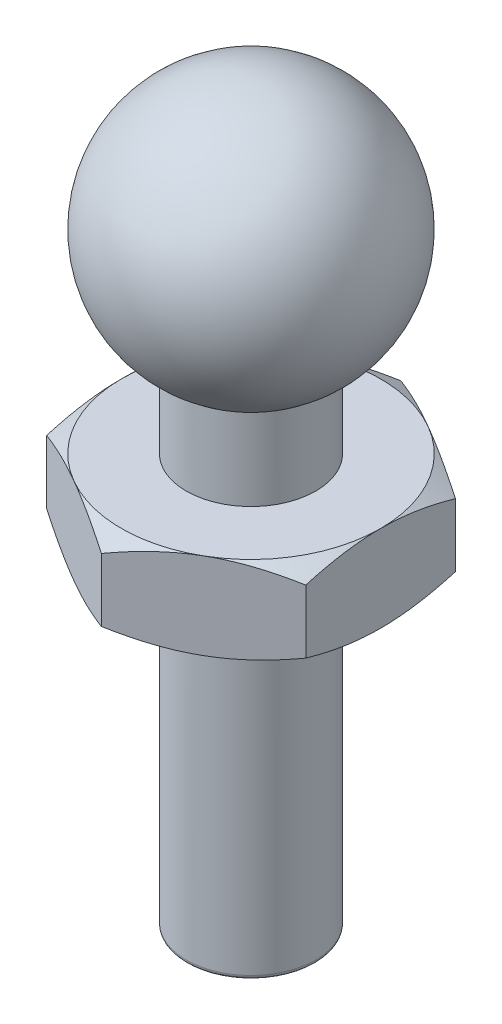
ISO-10303-21;
HEADER;
FILE_DESCRIPTION(('STEP AP214'),'2;1');
FILE_NAME('part.step','',(''),(''),'','','');
FILE_SCHEMA(('AUTOMOTIVE_DESIGN { 1 0 10303 214 1 1 1 1 }'));
ENDSEC;
DATA;
#1=APPLICATION_CONTEXT('core data for automotive mechanical design processes');
#2=APPLICATION_PROTOCOL_DEFINITION('international standard','automotive_design',2000,#1);
#3=PRODUCT_CONTEXT('',#1,'mechanical');
#4=PRODUCT('Part','Part','',(#3));
#5=PRODUCT_RELATED_PRODUCT_CATEGORY('part','',(#4));
#6=PRODUCT_DEFINITION_FORMATION('','',#4);
#7=PRODUCT_DEFINITION_CONTEXT('part definition',#1,'design');
#8=PRODUCT_DEFINITION('design','',#6,#7);
#9=PRODUCT_DEFINITION_SHAPE('','',#8);
#10=(LENGTH_UNIT() NAMED_UNIT(*) SI_UNIT(.MILLI.,.METRE.));
#11=(NAMED_UNIT(*) PLANE_ANGLE_UNIT() SI_UNIT($,.RADIAN.));
#12=(NAMED_UNIT(*) SI_UNIT($,.STERADIAN.) SOLID_ANGLE_UNIT());
#13=UNCERTAINTY_MEASURE_WITH_UNIT(LENGTH_MEASURE(1.E-05),#10,'distance_accuracy_value','');
#14=(GEOMETRIC_REPRESENTATION_CONTEXT(3) GLOBAL_UNCERTAINTY_ASSIGNED_CONTEXT((#13)) GLOBAL_UNIT_ASSIGNED_CONTEXT((#10,
#11,#12)) REPRESENTATION_CONTEXT('',''));
#15=CARTESIAN_POINT('',(0.,0.,0.));
#16=DIRECTION('',(0.,0.,1.));
#17=DIRECTION('',(1.,0.,0.));
#18=AXIS2_PLACEMENT_3D('',#15,#16,#17);
#19=CARTESIAN_POINT('',(3.,9.5,1.73205080756888));
#20=DIRECTION('',(-1.,0.,0.));
#21=DIRECTION('',(0.,0.,1.));
#22=AXIS2_PLACEMENT_3D('',#19,#20,#21);
#23=PLANE('',#22);
#24=CARTESIAN_POINT('',(3.,7.49669275597267,5.73225080756888));
#25=CARTESIAN_POINT('',(3.,7.56535762873894,5.59799811373669));
#26=CARTESIAN_POINT('',(3.,7.63362658074956,5.46354106552018));
#27=CARTESIAN_POINT('',(3.,7.7691751977503,5.19412594711896));
#28=CARTESIAN_POINT('',(3.,7.83645484167597,5.05916786634262));
#29=CARTESIAN_POINT('',(3.,7.96993872408742,4.78843231789163));
#30=CARTESIAN_POINT('',(3.,8.0361409223391,4.65265384244875));
#31=CARTESIAN_POINT('',(3.,8.16708055525372,4.38038885038152));
#32=CARTESIAN_POINT('',(3.,8.23181796851999,4.24390232345015));
#33=CARTESIAN_POINT('',(3.,8.36273075239076,3.96310511366176));
#34=CARTESIAN_POINT('',(3.,8.42881132731156,3.81875010473635));
#35=CARTESIAN_POINT('',(3.,8.55842928727965,3.52890389215656));
#36=CARTESIAN_POINT('',(3.,8.62196674541402,3.38341272129836));
#37=CARTESIAN_POINT('',(3.,8.74573518476893,3.0911428032025));
#38=CARTESIAN_POINT('',(3.,8.80596844827941,2.94436502804428));
#39=CARTESIAN_POINT('',(3.,8.92221294586851,2.64909731827644));
#40=CARTESIAN_POINT('',(3.,8.97822314680859,2.50060697487877));
#41=CARTESIAN_POINT('',(3.,9.09420348606466,2.17495473766774));
#42=CARTESIAN_POINT('',(3.,9.15309774811246,1.99740334689548));
#43=CARTESIAN_POINT('',(3.,9.26029523419006,1.63917764376158));
#44=CARTESIAN_POINT('',(3.,9.30860404614459,1.45850503366087));
#45=CARTESIAN_POINT('',(3.,9.39023263279609,1.09720914532956));
#46=CARTESIAN_POINT('',(3.,9.42381477693698,0.916647599895759));
#47=CARTESIAN_POINT('',(3.,9.46126742176692,0.644079261802789));
#48=CARTESIAN_POINT('',(3.,9.47159787377878,0.552943422867096));
#49=CARTESIAN_POINT('',(3.,9.48763454600052,0.370270654947729));
#50=CARTESIAN_POINT('',(3.,9.49334144079801,0.278733786435311));
#51=CARTESIAN_POINT('',(3.,9.49996614854262,0.0944078517722107));
#52=CARTESIAN_POINT('',(3.,9.5008268616344,0.00161671746076241));
#53=CARTESIAN_POINT('',(3.,9.49757525562797,-0.183877598413798));
#54=CARTESIAN_POINT('',(3.,9.49346292019229,-0.276580779686966));
#55=CARTESIAN_POINT('',(3.,9.48041370767168,-0.461668088480513));
#56=CARTESIAN_POINT('',(3.,9.47147558711607,-0.554052127589441));
#57=CARTESIAN_POINT('',(3.,9.4490819835307,-0.738276464049772));
#58=CARTESIAN_POINT('',(3.,9.43562578745626,-0.830116673244042));
#59=CARTESIAN_POINT('',(3.,9.38848678345653,-1.1081241349506));
#60=CARTESIAN_POINT('',(3.,9.34831083516922,-1.29320289274649));
#61=CARTESIAN_POINT('',(3.,9.25483304091392,-1.65992833453579));
#62=CARTESIAN_POINT('',(3.,9.20152817481691,-1.8415742184766));
#63=CARTESIAN_POINT('',(3.,9.09001482170302,-2.18718321983853));
#64=CARTESIAN_POINT('',(3.,9.03254960886738,-2.35139002090273));
#65=CARTESIAN_POINT('',(3.,8.91157770593577,-2.67757637701535));
#66=CARTESIAN_POINT('',(3.,8.84806982210383,-2.83955548471668));
#67=CARTESIAN_POINT('',(3.,8.71649668995848,-3.16180541641892));
#68=CARTESIAN_POINT('',(3.,8.64842746398323,-3.32207460435457));
#69=CARTESIAN_POINT('',(3.,8.50888164672137,-3.64112437712565));
#70=CARTESIAN_POINT('',(3.,8.43740489080743,-3.79990488959462));
#71=CARTESIAN_POINT('',(3.,8.29572041514807,-4.10783154121877));
#72=CARTESIAN_POINT('',(3.,8.22564804300012,-4.25704019529893));
#73=CARTESIAN_POINT('',(3.,8.0836551872923,-4.55457880885657));
#74=CARTESIAN_POINT('',(3.,8.01173465191385,-4.70290874355283));
#75=CARTESIAN_POINT('',(3.,7.8666308572428,-4.99841900754648));
#76=CARTESIAN_POINT('',(3.,7.79345182235509,-5.14560141584992));
#77=CARTESIAN_POINT('',(3.,7.64590152942625,-5.43935321353678));
#78=CARTESIAN_POINT('',(3.,7.57153036655204,-5.58592265068708));
#79=CARTESIAN_POINT('',(3.,7.49669275597267,-5.73225080756888));
#80=B_SPLINE_CURVE_WITH_KNOTS('',3,(#24,#25,#26,#27,#28,#29,#30,#31,#32,#33,#34,#35,#36,#37,#38,
#39,#40,#41,#42,#43,#44,#45,#46,#47,#48,#49,#50,#51,#52,#53,#54,#55,#56,#57,#58,#59,#60,#61,#62,
#63,#64,#65,#66,#67,#68,#69,#70,#71,#72,#73,#74,#75,#76,#77,#78,#79),.UNSPECIFIED.,.F.,.F.,(4,2,
2,2,2,2,2,2,2,2,2,2,2,2,2,2,2,2,2,2,2,2,2,2,2,2,2,4),(0.,0.452382016001322,0.90477365026535,
1.35794045354517,1.81111387213612,2.2873771437625,2.76362671813268,3.23954308217786,
3.71557550010852,4.27652369616462,4.83717505756687,5.38738613645125,5.66244417939779,
5.937462083513,6.21571369559986,6.4939662218021,6.77229048018743,7.05065868449287,
7.61810965270507,8.18569127741244,8.70745206667822,9.2293161451901,9.75164138486646,
10.2739918851653,10.7685068932809,11.2630357817083,11.756143015984,12.2492110799155),.UNSPECIFIED.);
#81=CARTESIAN_POINT('',(3.,9.23205080756888,1.73205080756888));
#82=VERTEX_POINT('',#81);
#83=CARTESIAN_POINT('',(3.,9.5,0.));
#84=VERTEX_POINT('',#83);
#85=EDGE_CURVE('E171',#82,#84,#80,.T.);
#86=ORIENTED_EDGE('',*,*,#85,.F.);
#87=DIRECTION('',(0.,-1.,0.));
#88=VECTOR('',#87,1.);
#89=CARTESIAN_POINT('',(3.,9.5,1.73205080756888));
#90=LINE('',#89,#88);
#91=CARTESIAN_POINT('',(3.,7.7679491924311,1.73205080756891));
#92=VERTEX_POINT('',#91);
#93=EDGE_CURVE('E295',#82,#92,#90,.T.);
#94=ORIENTED_EDGE('',*,*,#93,.T.);
#95=CARTESIAN_POINT('',(3.,9.50330724402733,-5.73225080756888));
#96=CARTESIAN_POINT('',(3.,9.43464237126105,-5.59799811373669));
#97=CARTESIAN_POINT('',(3.,9.36637341925044,-5.46354106552018));
#98=CARTESIAN_POINT('',(3.,9.2308248022497,-5.19412594711896));
#99=CARTESIAN_POINT('',(3.,9.16354515832403,-5.05916786634262));
#100=CARTESIAN_POINT('',(3.,9.03006127591258,-4.78843231789163));
#101=CARTESIAN_POINT('',(3.,8.9638590776609,-4.65265384244875));
#102=CARTESIAN_POINT('',(3.,8.83291944474628,-4.38038885038152));
#103=CARTESIAN_POINT('',(3.,8.76818203148001,-4.24390232345015));
#104=CARTESIAN_POINT('',(3.,8.63726924760924,-3.96310511366177));
#105=CARTESIAN_POINT('',(3.,8.57118867268844,-3.81875010473635));
#106=CARTESIAN_POINT('',(3.,8.44157071272035,-3.52890389215656));
#107=CARTESIAN_POINT('',(3.,8.37803325458598,-3.38341272129837));
#108=CARTESIAN_POINT('',(3.,8.25426481523107,-3.0911428032025));
#109=CARTESIAN_POINT('',(3.,8.19403155172058,-2.94436502804428));
#110=CARTESIAN_POINT('',(3.,8.07778705413149,-2.64909731827645));
#111=CARTESIAN_POINT('',(3.,8.02177685319141,-2.50060697487878));
#112=CARTESIAN_POINT('',(3.,7.90579651393534,-2.17495473766774));
#113=CARTESIAN_POINT('',(3.,7.84690225188753,-1.99740334689548));
#114=CARTESIAN_POINT('',(3.,7.73970476580994,-1.63917764376159));
#115=CARTESIAN_POINT('',(3.,7.6913959538554,-1.45850503366087));
#116=CARTESIAN_POINT('',(3.,7.60976736720391,-1.09720914532957));
#117=CARTESIAN_POINT('',(3.,7.57618522306301,-0.916647599895763));
#118=CARTESIAN_POINT('',(3.,7.53873257823308,-0.644079261802793));
#119=CARTESIAN_POINT('',(3.,7.52840212622121,-0.5529434228671));
#120=CARTESIAN_POINT('',(3.,7.51236545399948,-0.370270654947734));
#121=CARTESIAN_POINT('',(3.,7.50665855920199,-0.278733786435315));
#122=CARTESIAN_POINT('',(3.,7.50003385145738,-0.0944078517722148));
#123=CARTESIAN_POINT('',(3.,7.4991731383656,-0.00161671746076664));
#124=CARTESIAN_POINT('',(3.,7.50242474437203,0.183877598413794));
#125=CARTESIAN_POINT('',(3.,7.50653707980771,0.276580779686962));
#126=CARTESIAN_POINT('',(3.,7.51958629232831,0.461668088480508));
#127=CARTESIAN_POINT('',(3.,7.52852441288392,0.554052127589436));
#128=CARTESIAN_POINT('',(3.,7.5509180164693,0.738276464049767));
#129=CARTESIAN_POINT('',(3.,7.56437421254374,0.830116673244036));
#130=CARTESIAN_POINT('',(3.,7.61151321654346,1.10812413495059));
#131=CARTESIAN_POINT('',(3.,7.65168916483078,1.29320289274649));
#132=CARTESIAN_POINT('',(3.,7.74516695908608,1.65992833453578));
#133=CARTESIAN_POINT('',(3.,7.79847182518309,1.84157421847659));
#134=CARTESIAN_POINT('',(3.,7.90998517829697,2.18718321983852));
#135=CARTESIAN_POINT('',(3.,7.96745039113261,2.35139002090273));
#136=CARTESIAN_POINT('',(3.,8.08842229406423,2.67757637701535));
#137=CARTESIAN_POINT('',(3.,8.15193017789617,2.83955548471668));
#138=CARTESIAN_POINT('',(3.,8.28350331004152,3.16180541641892));
#139=CARTESIAN_POINT('',(3.,8.35157253601677,3.32207460435457));
#140=CARTESIAN_POINT('',(3.,8.49111835327863,3.64112437712565));
#141=CARTESIAN_POINT('',(3.,8.56259510919257,3.79990488959462));
#142=CARTESIAN_POINT('',(3.,8.70427958485193,4.10783154121877));
#143=CARTESIAN_POINT('',(3.,8.77435195699987,4.25704019529893));
#144=CARTESIAN_POINT('',(3.,8.9163448127077,4.55457880885657));
#145=CARTESIAN_POINT('',(3.,8.98826534808615,4.70290874355283));
#146=CARTESIAN_POINT('',(3.,9.13336914275719,4.99841900754648));
#147=CARTESIAN_POINT('',(3.,9.20654817764491,5.14560141584992));
#148=CARTESIAN_POINT('',(3.,9.35409847057374,5.43935321353677));
#149=CARTESIAN_POINT('',(3.,9.42846963344796,5.58592265068707));
#150=CARTESIAN_POINT('',(3.,9.50330724402733,5.73225080756888));
#151=B_SPLINE_CURVE_WITH_KNOTS('',3,(#95,#96,#97,#98,#99,#100,#101,#102,#103,#104,#105,#106,
#107,#108,#109,#110,#111,#112,#113,#114,#115,#116,#117,#118,#119,#120,#121,#122,#123,#124,#125,
#126,#127,#128,#129,#130,#131,#132,#133,#134,#135,#136,#137,#138,#139,#140,#141,#142,#143,#144,
#145,#146,#147,#148,#149,#150),.UNSPECIFIED.,.F.,.F.,(4,2,2,2,2,2,2,2,2,2,2,2,2,2,2,2,2,2,2,2,2,
2,2,2,2,2,2,4),(0.,0.452382016001322,0.904773650265349,1.35794045354517,1.81111387213612,
2.2873771437625,2.76362671813268,3.23954308217786,3.71557550010852,4.27652369616462,
4.83717505756687,5.38738613645124,5.66244417939779,5.937462083513,6.21571369559986,
6.4939662218021,6.77229048018743,7.05065868449287,7.61810965270507,8.18569127741243,
8.70745206667821,9.2293161451901,9.75164138486646,10.2739918851653,10.7685068932809,
11.2630357817083,11.756143015984,12.2492110799155),.UNSPECIFIED.);
#152=CARTESIAN_POINT('',(3.,7.5,0.));
#153=VERTEX_POINT('',#152);
#154=EDGE_CURVE('E338',#153,#92,#151,.T.);
#155=ORIENTED_EDGE('',*,*,#154,.F.);
#156=CARTESIAN_POINT('',(3.,7.76794919243112,-1.73205080756888));
#157=VERTEX_POINT('',#156);
#158=EDGE_CURVE('E344',#157,#153,#151,.T.);
#159=ORIENTED_EDGE('',*,*,#158,.F.);
#160=DIRECTION('',(0.,-1.,0.));
#161=VECTOR('',#160,1.);
#162=CARTESIAN_POINT('',(3.,9.5,-1.73205080756888));
#163=LINE('',#162,#161);
#164=CARTESIAN_POINT('',(3.,9.23205080756888,-1.73205080756888));
#165=VERTEX_POINT('',#164);
#166=EDGE_CURVE('E306',#165,#157,#163,.T.);
#167=ORIENTED_EDGE('',*,*,#166,.F.);
#168=EDGE_CURVE('E163',#84,#165,#80,.T.);
#169=ORIENTED_EDGE('',*,*,#168,.F.);
#170=EDGE_LOOP('',(#86,#94,#155,#159,#167,#169));
#171=FACE_BOUND('',#170,.T.);
#172=ADVANCED_FACE('F47',(#171),#23,.F.);
#173=CARTESIAN_POINT('',(0.,9.5,3.46410161513775));
#174=DIRECTION('',(-0.5,0.,-0.866025403784439));
#175=DIRECTION('',(-0.866025403784439,0.,0.5));
#176=AXIS2_PLACEMENT_3D('',#173,#174,#175);
#177=PLANE('',#176);
#178=CARTESIAN_POINT('',(-0.000200000000000962,9.23198413756899,3.46421708519159));
#179=CARTESIAN_POINT('',(0.131635206588331,9.27594629554769,3.38810199317915));
#180=CARTESIAN_POINT('',(0.264608405355248,9.31592841370737,3.31132988107606));
#181=CARTESIAN_POINT('',(0.532857420002055,9.38571791955454,3.15645624025988));
#182=CARTESIAN_POINT('',(0.668138002634341,9.41550061773462,3.078351959461));
#183=CARTESIAN_POINT('',(0.937022602096482,9.46186216078874,2.92311136358059));
#184=CARTESIAN_POINT('',(1.07058524542946,9.47874955887705,2.84599893549861));
#185=CARTESIAN_POINT('',(1.33833905729569,9.49891035755148,2.6914112001411));
#186=CARTESIAN_POINT('',(1.47252925247984,9.50220045221892,2.61393645482892));
#187=CARTESIAN_POINT('',(1.72327559769581,9.49535946911461,2.46916798492017));
#188=CARTESIAN_POINT('',(1.83986926497267,9.48690808580738,2.40185259973206));
#189=CARTESIAN_POINT('',(2.07229698497464,9.46012105699297,2.2676603930218));
#190=CARTESIAN_POINT('',(2.18813023365133,9.44177625913829,2.2007840357172));
#191=CARTESIAN_POINT('',(2.42103725705637,9.39591524914667,2.06631510305815));
#192=CARTESIAN_POINT('',(2.53808155051394,9.36820461473692,1.99873954872331));
#193=CARTESIAN_POINT('',(2.77042435049912,9.3053122048626,1.86459637060759));
#194=CARTESIAN_POINT('',(2.88572583417111,9.27014520897844,1.79802702797161));
#195=CARTESIAN_POINT('',(3.0002,9.23198413756899,1.73193533751504));
#196=B_SPLINE_CURVE_WITH_KNOTS('',3,(#178,#179,#180,#181,#182,#183,#184,#185,#186,#187,#188,
#189,#190,#191,#192,#193,#194,#195),.UNSPECIFIED.,.F.,.F.,(4,2,2,2,2,2,2,2,4),(0.,
0.47553983010304,0.952222784107964,1.41710776961288,1.88142182298026,2.28572436316091,
2.69040156475039,3.10405572063576,3.5168974940707),.UNSPECIFIED.);
#197=CARTESIAN_POINT('',(0.,9.23205080756888,3.46410161513775));
#198=VERTEX_POINT('',#197);
#199=CARTESIAN_POINT('',(1.5,9.5,2.59807621135332));
#200=VERTEX_POINT('',#199);
#201=EDGE_CURVE('E220',#198,#200,#196,.T.);
#202=ORIENTED_EDGE('',*,*,#201,.F.);
#203=DIRECTION('',(0.,-1.,0.));
#204=VECTOR('',#203,1.);
#205=CARTESIAN_POINT('',(0.,9.5,3.46410161513775));
#206=LINE('',#205,#204);
#207=CARTESIAN_POINT('',(0.,7.76794919243112,3.46410161513775));
#208=VERTEX_POINT('',#207);
#209=EDGE_CURVE('E305',#198,#208,#206,.T.);
#210=ORIENTED_EDGE('',*,*,#209,.T.);
#211=CARTESIAN_POINT('',(3.0002,7.76801586243101,1.73193533751504));
#212=CARTESIAN_POINT('',(2.86836479341167,7.7240537044523,1.80805042952748));
#213=CARTESIAN_POINT('',(2.73539159464475,7.68407158629262,1.88482254163057));
#214=CARTESIAN_POINT('',(2.46714257999794,7.61428208044546,2.03969618244675));
#215=CARTESIAN_POINT('',(2.33186199736566,7.58449938226538,2.11780046324563));
#216=CARTESIAN_POINT('',(2.06297739790352,7.53813783921125,2.27304105912605));
#217=CARTESIAN_POINT('',(1.92941475457054,7.52125044112295,2.35015348720802));
#218=CARTESIAN_POINT('',(1.66166094270431,7.50108964244852,2.50474122256553));
#219=CARTESIAN_POINT('',(1.52747074752016,7.49779954778108,2.58221596787771));
#220=CARTESIAN_POINT('',(1.27672440230419,7.50464053088539,2.72698443778646));
#221=CARTESIAN_POINT('',(1.16013073502732,7.51309191419261,2.79429982297457));
#222=CARTESIAN_POINT('',(0.927703015025364,7.53987894300703,2.92849202968483));
#223=CARTESIAN_POINT('',(0.811869766348669,7.55822374086171,2.99536838698943));
#224=CARTESIAN_POINT('',(0.578962742943632,7.60408475085333,3.12983731964848));
#225=CARTESIAN_POINT('',(0.461918449486059,7.63179538526308,3.19741287398332));
#226=CARTESIAN_POINT('',(0.229575649500875,7.6946877951374,3.33155605209904));
#227=CARTESIAN_POINT('',(0.114274165828893,7.72985479102155,3.39812539473502));
#228=CARTESIAN_POINT('',(-0.000200000000000659,7.76801586243101,3.46421708519159));
#229=B_SPLINE_CURVE_WITH_KNOTS('',3,(#211,#212,#213,#214,#215,#216,#217,#218,#219,#220,#221,
#222,#223,#224,#225,#226,#227,#228),.UNSPECIFIED.,.F.,.F.,(4,2,2,2,2,2,2,2,4),(0.,
0.47553983010304,0.952222784107963,1.41710776961288,1.88142182298026,2.28572436316091,
2.69040156475039,3.10405572063576,3.5168974940707),.UNSPECIFIED.);
#230=CARTESIAN_POINT('',(1.5,7.5,2.59807621135332));
#231=VERTEX_POINT('',#230);
#232=EDGE_CURVE('E248',#231,#208,#229,.T.);
#233=ORIENTED_EDGE('',*,*,#232,.F.);
#234=EDGE_CURVE('E238',#92,#231,#229,.T.);
#235=ORIENTED_EDGE('',*,*,#234,.F.);
#236=ORIENTED_EDGE('',*,*,#93,.F.);
#237=EDGE_CURVE('E213',#200,#82,#196,.T.);
#238=ORIENTED_EDGE('',*,*,#237,.F.);
#239=EDGE_LOOP('',(#202,#210,#233,#235,#236,#238));
#240=FACE_BOUND('',#239,.T.);
#241=ADVANCED_FACE('F228',(#240),#177,.F.);
#242=CARTESIAN_POINT('',(-3.,9.5,1.73205080756888));
#243=DIRECTION('',(0.5,0.,-0.866025403784439));
#244=DIRECTION('',(-0.866025403784439,0.,-0.5));
#245=AXIS2_PLACEMENT_3D('',#242,#243,#244);
#246=PLANE('',#245);
#247=CARTESIAN_POINT('',(-3.0002,9.23198413756899,1.73193533751504));
#248=CARTESIAN_POINT('',(-2.86836479341167,9.27594629554769,1.80805042952748));
#249=CARTESIAN_POINT('',(-2.73539159464475,9.31592841370737,1.88482254163057));
#250=CARTESIAN_POINT('',(-2.46714257999795,9.38571791955454,2.03969618244675));
#251=CARTESIAN_POINT('',(-2.33186199736566,9.41550061773462,2.11780046324563));
#252=CARTESIAN_POINT('',(-2.06297739790352,9.46186216078874,2.27304105912605));
#253=CARTESIAN_POINT('',(-1.92941475457054,9.47874955887705,2.35015348720802));
#254=CARTESIAN_POINT('',(-1.66166094270431,9.49891035755148,2.50474122256553));
#255=CARTESIAN_POINT('',(-1.52747074752016,9.50220045221892,2.58221596787771));
#256=CARTESIAN_POINT('',(-1.27672440230419,9.49535946911461,2.72698443778646));
#257=CARTESIAN_POINT('',(-1.16013073502733,9.48690808580738,2.79429982297457));
#258=CARTESIAN_POINT('',(-0.927703015025365,9.46012105699296,2.92849202968483));
#259=CARTESIAN_POINT('',(-0.81186976634867,9.44177625913829,2.99536838698943));
#260=CARTESIAN_POINT('',(-0.578962742943634,9.39591524914667,3.12983731964848));
#261=CARTESIAN_POINT('',(-0.461918449486061,9.36820461473692,3.19741287398332));
#262=CARTESIAN_POINT('',(-0.229575649500877,9.3053122048626,3.33155605209904));
#263=CARTESIAN_POINT('',(-0.114274165828895,9.27014520897844,3.39812539473502));
#264=CARTESIAN_POINT('',(0.000199999999998685,9.23198413756899,3.46421708519159));
#265=B_SPLINE_CURVE_WITH_KNOTS('',3,(#247,#248,#249,#250,#251,#252,#253,#254,#255,#256,#257,
#258,#259,#260,#261,#262,#263,#264),.UNSPECIFIED.,.F.,.F.,(4,2,2,2,2,2,2,2,4),(0.,
0.475539830103041,0.952222784107964,1.41710776961288,1.88142182298026,2.28572436316091,
2.69040156475039,3.10405572063576,3.5168974940707),.UNSPECIFIED.);
#266=CARTESIAN_POINT('',(-3.,9.2320508075689,1.73205080756891));
#267=VERTEX_POINT('',#266);
#268=CARTESIAN_POINT('',(-1.5,9.5,2.59807621135332));
#269=VERTEX_POINT('',#268);
#270=EDGE_CURVE('E368',#267,#269,#265,.T.);
#271=ORIENTED_EDGE('',*,*,#270,.F.);
#272=DIRECTION('',(0.,-1.,0.));
#273=VECTOR('',#272,1.);
#274=CARTESIAN_POINT('',(-3.,9.5,1.73205080756888));
#275=LINE('',#274,#273);
#276=CARTESIAN_POINT('',(-3.,7.76794919243112,1.73205080756888));
#277=VERTEX_POINT('',#276);
#278=EDGE_CURVE('E310',#267,#277,#275,.T.);
#279=ORIENTED_EDGE('',*,*,#278,.T.);
#280=CARTESIAN_POINT('',(0.000199999999999142,7.76801586243101,3.46421708519159));
#281=CARTESIAN_POINT('',(-0.131635206588333,7.7240537044523,3.38810199317915));
#282=CARTESIAN_POINT('',(-0.26460840535525,7.68407158629263,3.31132988107606));
#283=CARTESIAN_POINT('',(-0.532857420002057,7.61428208044546,3.15645624025988));
#284=CARTESIAN_POINT('',(-0.668138002634342,7.58449938226538,3.078351959461));
#285=CARTESIAN_POINT('',(-0.937022602096484,7.53813783921125,2.92311136358059));
#286=CARTESIAN_POINT('',(-1.07058524542946,7.52125044112295,2.84599893549861));
#287=CARTESIAN_POINT('',(-1.33833905729569,7.50108964244852,2.6914112001411));
#288=CARTESIAN_POINT('',(-1.47252925247984,7.49779954778108,2.61393645482892));
#289=CARTESIAN_POINT('',(-1.72327559769581,7.50464053088539,2.46916798492017));
#290=CARTESIAN_POINT('',(-1.83986926497268,7.51309191419262,2.40185259973206));
#291=CARTESIAN_POINT('',(-2.07229698497464,7.53987894300703,2.2676603930218));
#292=CARTESIAN_POINT('',(-2.18813023365133,7.55822374086171,2.2007840357172));
#293=CARTESIAN_POINT('',(-2.42103725705637,7.60408475085333,2.06631510305815));
#294=CARTESIAN_POINT('',(-2.53808155051394,7.63179538526308,1.99873954872331));
#295=CARTESIAN_POINT('',(-2.77042435049913,7.6946877951374,1.86459637060759));
#296=CARTESIAN_POINT('',(-2.88572583417111,7.72985479102156,1.79802702797161));
#297=CARTESIAN_POINT('',(-3.0002,7.76801586243101,1.73193533751504));
#298=B_SPLINE_CURVE_WITH_KNOTS('',3,(#280,#281,#282,#283,#284,#285,#286,#287,#288,#289,#290,
#291,#292,#293,#294,#295,#296,#297),.UNSPECIFIED.,.F.,.F.,(4,2,2,2,2,2,2,2,4),(0.,
0.475539830103041,0.952222784107964,1.41710776961288,1.88142182298026,2.28572436316091,
2.69040156475039,3.10405572063576,3.5168974940707),.UNSPECIFIED.);
#299=CARTESIAN_POINT('',(-1.5,7.5,2.59807621135332));
#300=VERTEX_POINT('',#299);
#301=EDGE_CURVE('E394',#300,#277,#298,.T.);
#302=ORIENTED_EDGE('',*,*,#301,.F.);
#303=EDGE_CURVE('E257',#208,#300,#298,.T.);
#304=ORIENTED_EDGE('',*,*,#303,.F.);
#305=ORIENTED_EDGE('',*,*,#209,.F.);
#306=EDGE_CURVE('E221',#269,#198,#265,.T.);
#307=ORIENTED_EDGE('',*,*,#306,.F.);
#308=EDGE_LOOP('',(#271,#279,#302,#304,#305,#307));
#309=FACE_BOUND('',#308,.T.);
#310=ADVANCED_FACE('F231',(#309),#246,.F.);
#311=CARTESIAN_POINT('',(-3.,9.5,-1.73205080756888));
#312=DIRECTION('',(1.,0.,0.));
#313=DIRECTION('',(0.,0.,-1.));
#314=AXIS2_PLACEMENT_3D('',#311,#312,#313);
#315=PLANE('',#314);
#316=CARTESIAN_POINT('',(-3.,7.49669275597267,-5.73225080756888));
#317=CARTESIAN_POINT('',(-3.,7.56535762873894,-5.59799811373669));
#318=CARTESIAN_POINT('',(-3.,7.63362658074956,-5.46354106552018));
#319=CARTESIAN_POINT('',(-3.,7.7691751977503,-5.19412594711896));
#320=CARTESIAN_POINT('',(-3.,7.83645484167597,-5.05916786634262));
#321=CARTESIAN_POINT('',(-3.,7.96993872408742,-4.78843231789163));
#322=CARTESIAN_POINT('',(-3.,8.0361409223391,-4.65265384244875));
#323=CARTESIAN_POINT('',(-3.,8.16708055525372,-4.38038885038152));
#324=CARTESIAN_POINT('',(-3.,8.23181796851998,-4.24390232345015));
#325=CARTESIAN_POINT('',(-3.,8.36273075239075,-3.96310511366176));
#326=CARTESIAN_POINT('',(-3.,8.42881132731156,-3.81875010473635));
#327=CARTESIAN_POINT('',(-3.,8.55842928727965,-3.52890389215656));
#328=CARTESIAN_POINT('',(-3.,8.62196674541402,-3.38341272129836));
#329=CARTESIAN_POINT('',(-3.,8.74573518476892,-3.0911428032025));
#330=CARTESIAN_POINT('',(-3.,8.80596844827941,-2.94436502804428));
#331=CARTESIAN_POINT('',(-3.,8.92221294586851,-2.64909731827644));
#332=CARTESIAN_POINT('',(-3.,8.97822314680859,-2.50060697487877));
#333=CARTESIAN_POINT('',(-3.,9.09420348606466,-2.17495473766773));
#334=CARTESIAN_POINT('',(-3.,9.15309774811246,-1.99740334689548));
#335=CARTESIAN_POINT('',(-3.,9.26029523419006,-1.63917764376158));
#336=CARTESIAN_POINT('',(-3.,9.30860404614459,-1.45850503366086));
#337=CARTESIAN_POINT('',(-3.,9.39023263279609,-1.09720914532956));
#338=CARTESIAN_POINT('',(-3.,9.42381477693698,-0.916647599895757));
#339=CARTESIAN_POINT('',(-3.,9.46126742176692,-0.644079261802787));
#340=CARTESIAN_POINT('',(-3.,9.47159787377878,-0.552943422867094));
#341=CARTESIAN_POINT('',(-3.,9.48763454600052,-0.370270654947727));
#342=CARTESIAN_POINT('',(-3.,9.49334144079801,-0.278733786435309));
#343=CARTESIAN_POINT('',(-3.,9.49996614854262,-0.0944078517722076));
#344=CARTESIAN_POINT('',(-3.,9.5008268616344,-0.00161671746075906));
#345=CARTESIAN_POINT('',(-3.,9.49757525562797,0.183877598413802));
#346=CARTESIAN_POINT('',(-3.,9.49346292019229,0.276580779686969));
#347=CARTESIAN_POINT('',(-3.,9.48041370767168,0.461668088480515));
#348=CARTESIAN_POINT('',(-3.,9.47147558711607,0.554052127589443));
#349=CARTESIAN_POINT('',(-3.,9.4490819835307,0.738276464049774));
#350=CARTESIAN_POINT('',(-3.,9.43562578745626,0.830116673244044));
#351=CARTESIAN_POINT('',(-3.,9.38848678345653,1.1081241349506));
#352=CARTESIAN_POINT('',(-3.,9.34831083516922,1.29320289274649));
#353=CARTESIAN_POINT('',(-3.,9.25483304091392,1.65992833453579));
#354=CARTESIAN_POINT('',(-3.,9.2015281748169,1.8415742184766));
#355=CARTESIAN_POINT('',(-3.,9.09001482170302,2.18718321983853));
#356=CARTESIAN_POINT('',(-3.,9.03254960886738,2.35139002090274));
#357=CARTESIAN_POINT('',(-3.,8.91157770593576,2.67757637701536));
#358=CARTESIAN_POINT('',(-3.,8.84806982210383,2.83955548471668));
#359=CARTESIAN_POINT('',(-3.,8.71649668995848,3.16180541641892));
#360=CARTESIAN_POINT('',(-3.,8.64842746398322,3.32207460435457));
#361=CARTESIAN_POINT('',(-3.,8.50888164672136,3.64112437712565));
#362=CARTESIAN_POINT('',(-3.,8.43740489080742,3.79990488959462));
#363=CARTESIAN_POINT('',(-3.,8.29572041514807,4.10783154121877));
#364=CARTESIAN_POINT('',(-3.,8.22564804300012,4.25704019529893));
#365=CARTESIAN_POINT('',(-3.,8.0836551872923,4.55457880885657));
#366=CARTESIAN_POINT('',(-3.,8.01173465191384,4.70290874355283));
#367=CARTESIAN_POINT('',(-3.,7.8666308572428,4.99841900754648));
#368=CARTESIAN_POINT('',(-3.,7.79345182235509,5.14560141584992));
#369=CARTESIAN_POINT('',(-3.,7.64590152942626,5.43935321353677));
#370=CARTESIAN_POINT('',(-3.,7.57153036655204,5.58592265068707));
#371=CARTESIAN_POINT('',(-3.,7.49669275597267,5.73225080756888));
#372=B_SPLINE_CURVE_WITH_KNOTS('',3,(#316,#317,#318,#319,#320,#321,#322,#323,#324,#325,#326,
#327,#328,#329,#330,#331,#332,#333,#334,#335,#336,#337,#338,#339,#340,#341,#342,#343,#344,#345,
#346,#347,#348,#349,#350,#351,#352,#353,#354,#355,#356,#357,#358,#359,#360,#361,#362,#363,#364,
#365,#366,#367,#368,#369,#370,#371),.UNSPECIFIED.,.F.,.F.,(4,2,2,2,2,2,2,2,2,2,2,2,2,2,2,2,2,2,
2,2,2,2,2,2,2,2,2,4),(0.,0.452382016001321,0.904773650265348,1.35794045354517,1.81111387213612,
2.2873771437625,2.76362671813268,3.23954308217786,3.71557550010852,4.27652369616462,
4.83717505756687,5.38738613645125,5.66244417939779,5.93746208351301,6.21571369559987,
6.4939662218021,6.77229048018743,7.05065868449287,7.61810965270507,8.18569127741244,
8.70745206667822,9.2293161451901,9.75164138486646,10.2739918851653,10.7685068932809,
11.2630357817083,11.756143015984,12.2492110799155),.UNSPECIFIED.);
#373=CARTESIAN_POINT('',(-3.,9.23205080756888,-1.73205080756888));
#374=VERTEX_POINT('',#373);
#375=CARTESIAN_POINT('',(-3.,9.5,0.));
#376=VERTEX_POINT('',#375);
#377=EDGE_CURVE('E146',#374,#376,#372,.T.);
#378=ORIENTED_EDGE('',*,*,#377,.F.);
#379=DIRECTION('',(0.,-1.,0.));
#380=VECTOR('',#379,1.);
#381=CARTESIAN_POINT('',(-3.,9.5,-1.73205080756888));
#382=LINE('',#381,#380);
#383=CARTESIAN_POINT('',(-3.,7.76794919243112,-1.73205080756888));
#384=VERTEX_POINT('',#383);
#385=EDGE_CURVE('E169',#374,#384,#382,.T.);
#386=ORIENTED_EDGE('',*,*,#385,.T.);
#387=CARTESIAN_POINT('',(-3.,9.50330724402733,5.73225080756888));
#388=CARTESIAN_POINT('',(-3.,9.43464237126105,5.59799811373669));
#389=CARTESIAN_POINT('',(-3.,9.36637341925044,5.46354106552017));
#390=CARTESIAN_POINT('',(-3.,9.2308248022497,5.19412594711896));
#391=CARTESIAN_POINT('',(-3.,9.16354515832403,5.05916786634262));
#392=CARTESIAN_POINT('',(-3.,9.03006127591258,4.78843231789163));
#393=CARTESIAN_POINT('',(-3.,8.9638590776609,4.65265384244874));
#394=CARTESIAN_POINT('',(-3.,8.83291944474628,4.38038885038151));
#395=CARTESIAN_POINT('',(-3.,8.76818203148001,4.24390232345014));
#396=CARTESIAN_POINT('',(-3.,8.63726924760924,3.96310511366176));
#397=CARTESIAN_POINT('',(-3.,8.57118867268844,3.81875010473634));
#398=CARTESIAN_POINT('',(-3.,8.44157071272035,3.52890389215655));
#399=CARTESIAN_POINT('',(-3.,8.37803325458598,3.38341272129836));
#400=CARTESIAN_POINT('',(-3.,8.25426481523107,3.09114280320249));
#401=CARTESIAN_POINT('',(-3.,8.19403155172058,2.94436502804427));
#402=CARTESIAN_POINT('',(-3.,8.07778705413149,2.64909731827644));
#403=CARTESIAN_POINT('',(-3.,8.02177685319141,2.50060697487877));
#404=CARTESIAN_POINT('',(-3.,7.90579651393534,2.17495473766773));
#405=CARTESIAN_POINT('',(-3.,7.84690225188754,1.99740334689548));
#406=CARTESIAN_POINT('',(-3.,7.73970476580994,1.63917764376158));
#407=CARTESIAN_POINT('',(-3.,7.69139595385541,1.45850503366086));
#408=CARTESIAN_POINT('',(-3.,7.60976736720391,1.09720914532956));
#409=CARTESIAN_POINT('',(-3.,7.57618522306302,0.916647599895753));
#410=CARTESIAN_POINT('',(-3.,7.53873257823308,0.644079261802782));
#411=CARTESIAN_POINT('',(-3.,7.52840212622122,0.552943422867089));
#412=CARTESIAN_POINT('',(-3.,7.51236545399948,0.370270654947722));
#413=CARTESIAN_POINT('',(-3.,7.50665855920199,0.278733786435304));
#414=CARTESIAN_POINT('',(-3.,7.50003385145738,0.0944078517722031));
#415=CARTESIAN_POINT('',(-3.,7.49917313836561,0.00161671746075462));
#416=CARTESIAN_POINT('',(-3.,7.50242474437203,-0.183877598413806));
#417=CARTESIAN_POINT('',(-3.,7.50653707980771,-0.276580779686974));
#418=CARTESIAN_POINT('',(-3.,7.51958629232832,-0.46166808848052));
#419=CARTESIAN_POINT('',(-3.,7.52852441288393,-0.554052127589449));
#420=CARTESIAN_POINT('',(-3.,7.55091801646931,-0.738276464049779));
#421=CARTESIAN_POINT('',(-3.,7.56437421254375,-0.830116673244049));
#422=CARTESIAN_POINT('',(-3.,7.61151321654347,-1.10812413495061));
#423=CARTESIAN_POINT('',(-3.,7.65168916483078,-1.2932028927465));
#424=CARTESIAN_POINT('',(-3.,7.74516695908608,-1.6599283345358));
#425=CARTESIAN_POINT('',(-3.,7.7984718251831,-1.84157421847661));
#426=CARTESIAN_POINT('',(-3.,7.90998517829698,-2.18718321983853));
#427=CARTESIAN_POINT('',(-3.,7.96745039113262,-2.35139002090274));
#428=CARTESIAN_POINT('',(-3.,8.08842229406424,-2.67757637701536));
#429=CARTESIAN_POINT('',(-3.,8.15193017789617,-2.83955548471669));
#430=CARTESIAN_POINT('',(-3.,8.28350331004152,-3.16180541641893));
#431=CARTESIAN_POINT('',(-3.,8.35157253601678,-3.32207460435457));
#432=CARTESIAN_POINT('',(-3.,8.49111835327864,-3.64112437712566));
#433=CARTESIAN_POINT('',(-3.,8.56259510919258,-3.79990488959462));
#434=CARTESIAN_POINT('',(-3.,8.70427958485193,-4.10783154121877));
#435=CARTESIAN_POINT('',(-3.,8.77435195699988,-4.25704019529893));
#436=CARTESIAN_POINT('',(-3.,8.9163448127077,-4.55457880885658));
#437=CARTESIAN_POINT('',(-3.,8.98826534808616,-4.70290874355283));
#438=CARTESIAN_POINT('',(-3.,9.1333691427572,-4.99841900754648));
#439=CARTESIAN_POINT('',(-3.,9.20654817764491,-5.14560141584992));
#440=CARTESIAN_POINT('',(-3.,9.35409847057374,-5.43935321353677));
#441=CARTESIAN_POINT('',(-3.,9.42846963344796,-5.58592265068707));
#442=CARTESIAN_POINT('',(-3.,9.50330724402733,-5.73225080756888));
#443=B_SPLINE_CURVE_WITH_KNOTS('',3,(#387,#388,#389,#390,#391,#392,#393,#394,#395,#396,#397,
#398,#399,#400,#401,#402,#403,#404,#405,#406,#407,#408,#409,#410,#411,#412,#413,#414,#415,#416,
#417,#418,#419,#420,#421,#422,#423,#424,#425,#426,#427,#428,#429,#430,#431,#432,#433,#434,#435,
#436,#437,#438,#439,#440,#441,#442),.UNSPECIFIED.,.F.,.F.,(4,2,2,2,2,2,2,2,2,2,2,2,2,2,2,2,2,2,
2,2,2,2,2,2,2,2,2,4),(0.,0.452382016001321,0.904773650265349,1.35794045354517,1.81111387213612,
2.2873771437625,2.76362671813268,3.23954308217786,3.71557550010852,4.27652369616462,
4.83717505756687,5.38738613645125,5.66244417939779,5.93746208351301,6.21571369559987,
6.4939662218021,6.77229048018743,7.05065868449287,7.61810965270507,8.18569127741244,
8.70745206667822,9.2293161451901,9.75164138486646,10.2739918851653,10.7685068932809,
11.2630357817083,11.756143015984,12.2492110799155),.UNSPECIFIED.);
#444=CARTESIAN_POINT('',(-3.,7.5,0.));
#445=VERTEX_POINT('',#444);
#446=EDGE_CURVE('E401',#445,#384,#443,.T.);
#447=ORIENTED_EDGE('',*,*,#446,.F.);
#448=EDGE_CURVE('E408',#277,#445,#443,.T.);
#449=ORIENTED_EDGE('',*,*,#448,.F.);
#450=ORIENTED_EDGE('',*,*,#278,.F.);
#451=EDGE_CURVE('E376',#376,#267,#372,.T.);
#452=ORIENTED_EDGE('',*,*,#451,.F.);
#453=EDGE_LOOP('',(#378,#386,#447,#449,#450,#452));
#454=FACE_BOUND('',#453,.T.);
#455=ADVANCED_FACE('F409',(#454),#315,.F.);
#456=CARTESIAN_POINT('',(0.,9.5,-3.46410161513776));
#457=DIRECTION('',(0.5,0.,0.866025403784439));
#458=DIRECTION('',(0.866025403784439,0.,-0.5));
#459=AXIS2_PLACEMENT_3D('',#456,#457,#458);
#460=PLANE('',#459);
#461=CARTESIAN_POINT('',(0.000200000000000411,9.23198413756899,-3.46421708519159));
#462=CARTESIAN_POINT('',(-0.131635206588331,9.27594629554769,-3.38810199317915));
#463=CARTESIAN_POINT('',(-0.264608405355249,9.31592841370737,-3.31132988107607));
#464=CARTESIAN_POINT('',(-0.532857420002055,9.38571791955453,-3.15645624025988));
#465=CARTESIAN_POINT('',(-0.668138002634341,9.41550061773462,-3.078351959461));
#466=CARTESIAN_POINT('',(-0.937022602096483,9.46186216078874,-2.92311136358059));
#467=CARTESIAN_POINT('',(-1.07058524542946,9.47874955887705,-2.84599893549862));
#468=CARTESIAN_POINT('',(-1.33833905729569,9.49891035755148,-2.6914112001411));
#469=CARTESIAN_POINT('',(-1.47252925247984,9.50220045221892,-2.61393645482892));
#470=CARTESIAN_POINT('',(-1.72327559769581,9.49535946911461,-2.46916798492017));
#471=CARTESIAN_POINT('',(-1.83986926497268,9.48690808580738,-2.40185259973206));
#472=CARTESIAN_POINT('',(-2.07229698497464,9.46012105699296,-2.2676603930218));
#473=CARTESIAN_POINT('',(-2.18813023365133,9.44177625913829,-2.2007840357172));
#474=CARTESIAN_POINT('',(-2.42103725705637,9.39591524914667,-2.06631510305815));
#475=CARTESIAN_POINT('',(-2.53808155051394,9.36820461473692,-1.99873954872331));
#476=CARTESIAN_POINT('',(-2.77042435049913,9.3053122048626,-1.86459637060759));
#477=CARTESIAN_POINT('',(-2.88572583417111,9.27014520897844,-1.79802702797161));
#478=CARTESIAN_POINT('',(-3.0002,9.23198413756899,-1.73193533751504));
#479=B_SPLINE_CURVE_WITH_KNOTS('',3,(#461,#462,#463,#464,#465,#466,#467,#468,#469,#470,#471,
#472,#473,#474,#475,#476,#477,#478),.UNSPECIFIED.,.F.,.F.,(4,2,2,2,2,2,2,2,4),(0.,
0.47553983010304,0.952222784107964,1.41710776961288,1.88142182298026,2.28572436316091,
2.69040156475039,3.10405572063576,3.5168974940707),.UNSPECIFIED.);
#480=CARTESIAN_POINT('',(0.,9.23205080756888,-3.46410161513776));
#481=VERTEX_POINT('',#480);
#482=CARTESIAN_POINT('',(-1.5,9.5,-2.59807621135332));
#483=VERTEX_POINT('',#482);
#484=EDGE_CURVE('E157',#481,#483,#479,.T.);
#485=ORIENTED_EDGE('',*,*,#484,.F.);
#486=DIRECTION('',(0.,-1.,0.));
#487=VECTOR('',#486,1.);
#488=CARTESIAN_POINT('',(0.,9.5,-3.46410161513776));
#489=LINE('',#488,#487);
#490=CARTESIAN_POINT('',(0.,7.76794919243112,-3.46410161513776));
#491=VERTEX_POINT('',#490);
#492=EDGE_CURVE('E320',#481,#491,#489,.T.);
#493=ORIENTED_EDGE('',*,*,#492,.T.);
#494=CARTESIAN_POINT('',(-3.0002,7.76801586243101,-1.73193533751504));
#495=CARTESIAN_POINT('',(-2.86836479341167,7.72405370445231,-1.80805042952748));
#496=CARTESIAN_POINT('',(-2.73539159464475,7.68407158629263,-1.88482254163057));
#497=CARTESIAN_POINT('',(-2.46714257999794,7.61428208044547,-2.03969618244676));
#498=CARTESIAN_POINT('',(-2.33186199736566,7.58449938226538,-2.11780046324564));
#499=CARTESIAN_POINT('',(-2.06297739790352,7.53813783921126,-2.27304105912605));
#500=CARTESIAN_POINT('',(-1.92941475457054,7.52125044112295,-2.35015348720802));
#501=CARTESIAN_POINT('',(-1.66166094270431,7.50108964244852,-2.50474122256554));
#502=CARTESIAN_POINT('',(-1.52747074752016,7.49779954778108,-2.58221596787772));
#503=CARTESIAN_POINT('',(-1.27672440230419,7.50464053088539,-2.72698443778647));
#504=CARTESIAN_POINT('',(-1.16013073502732,7.51309191419262,-2.79429982297457));
#505=CARTESIAN_POINT('',(-0.927703015025363,7.53987894300703,-2.92849202968484));
#506=CARTESIAN_POINT('',(-0.811869766348668,7.55822374086171,-2.99536838698943));
#507=CARTESIAN_POINT('',(-0.578962742943632,7.60408475085333,-3.12983731964849));
#508=CARTESIAN_POINT('',(-0.461918449486059,7.63179538526308,-3.19741287398333));
#509=CARTESIAN_POINT('',(-0.229575649500875,7.6946877951374,-3.33155605209904));
#510=CARTESIAN_POINT('',(-0.114274165828893,7.72985479102156,-3.39812539473502));
#511=CARTESIAN_POINT('',(0.000200000000000587,7.76801586243101,-3.46421708519159));
#512=B_SPLINE_CURVE_WITH_KNOTS('',3,(#494,#495,#496,#497,#498,#499,#500,#501,#502,#503,#504,
#505,#506,#507,#508,#509,#510,#511),.UNSPECIFIED.,.F.,.F.,(4,2,2,2,2,2,2,2,4),(0.,
0.475539830103042,0.952222784107966,1.41710776961288,1.88142182298026,2.28572436316091,
2.69040156475039,3.10405572063576,3.5168974940707),.UNSPECIFIED.);
#513=CARTESIAN_POINT('',(-1.5,7.5,-2.59807621135332));
#514=VERTEX_POINT('',#513);
#515=EDGE_CURVE('E386',#514,#491,#512,.T.);
#516=ORIENTED_EDGE('',*,*,#515,.F.);
#517=EDGE_CURVE('E391',#384,#514,#512,.T.);
#518=ORIENTED_EDGE('',*,*,#517,.F.);
#519=ORIENTED_EDGE('',*,*,#385,.F.);
#520=EDGE_CURVE('E144',#483,#374,#479,.T.);
#521=ORIENTED_EDGE('',*,*,#520,.F.);
#522=EDGE_LOOP('',(#485,#493,#516,#518,#519,#521));
#523=FACE_BOUND('',#522,.T.);
#524=ADVANCED_FACE('F167',(#523),#460,.F.);
#525=CARTESIAN_POINT('',(3.,9.5,-1.73205080756888));
#526=DIRECTION('',(-0.5,0.,0.866025403784439));
#527=DIRECTION('',(0.866025403784439,0.,0.5));
#528=AXIS2_PLACEMENT_3D('',#525,#526,#527);
#529=PLANE('',#528);
#530=CARTESIAN_POINT('',(3.0002,9.23198413756899,-1.73193533751504));
#531=CARTESIAN_POINT('',(2.86836479341167,9.27594629554769,-1.80805042952749));
#532=CARTESIAN_POINT('',(2.73539159464475,9.31592841370737,-1.88482254163057));
#533=CARTESIAN_POINT('',(2.46714257999794,9.38571791955454,-2.03969618244676));
#534=CARTESIAN_POINT('',(2.33186199736566,9.41550061773462,-2.11780046324564));
#535=CARTESIAN_POINT('',(2.06297739790352,9.46186216078874,-2.27304105912605));
#536=CARTESIAN_POINT('',(1.92941475457054,9.47874955887705,-2.35015348720802));
#537=CARTESIAN_POINT('',(1.66166094270431,9.49891035755148,-2.50474122256554));
#538=CARTESIAN_POINT('',(1.52747074752016,9.50220045221892,-2.58221596787772));
#539=CARTESIAN_POINT('',(1.27672440230419,9.49535946911461,-2.72698443778647));
#540=CARTESIAN_POINT('',(1.16013073502732,9.48690808580738,-2.79429982297457));
#541=CARTESIAN_POINT('',(0.927703015025363,9.46012105699296,-2.92849202968484));
#542=CARTESIAN_POINT('',(0.811869766348668,9.44177625913829,-2.99536838698943));
#543=CARTESIAN_POINT('',(0.578962742943632,9.39591524914667,-3.12983731964849));
#544=CARTESIAN_POINT('',(0.461918449486059,9.36820461473692,-3.19741287398333));
#545=CARTESIAN_POINT('',(0.229575649500875,9.3053122048626,-3.33155605209904));
#546=CARTESIAN_POINT('',(0.114274165828894,9.27014520897844,-3.39812539473502));
#547=CARTESIAN_POINT('',(-0.000199999999999904,9.23198413756899,-3.46421708519159));
#548=B_SPLINE_CURVE_WITH_KNOTS('',3,(#530,#531,#532,#533,#534,#535,#536,#537,#538,#539,#540,
#541,#542,#543,#544,#545,#546,#547),.UNSPECIFIED.,.F.,.F.,(4,2,2,2,2,2,2,2,4),(0.,
0.475539830103041,0.952222784107964,1.41710776961288,1.88142182298026,2.28572436316091,
2.69040156475039,3.10405572063576,3.5168974940707),.UNSPECIFIED.);
#549=CARTESIAN_POINT('',(1.5,9.5,-2.59807621135332));
#550=VERTEX_POINT('',#549);
#551=EDGE_CURVE('E12',#165,#550,#548,.T.);
#552=ORIENTED_EDGE('',*,*,#551,.F.);
#553=ORIENTED_EDGE('',*,*,#166,.T.);
#554=CARTESIAN_POINT('',(-0.000199999999999589,7.76801586243101,-3.46421708519159));
#555=CARTESIAN_POINT('',(0.131635206588332,7.7240537044523,-3.38810199317915));
#556=CARTESIAN_POINT('',(0.26460840535525,7.68407158629263,-3.31132988107607));
#557=CARTESIAN_POINT('',(0.532857420002056,7.61428208044546,-3.15645624025988));
#558=CARTESIAN_POINT('',(0.668138002634342,7.58449938226538,-3.078351959461));
#559=CARTESIAN_POINT('',(0.937022602096484,7.53813783921125,-2.92311136358059));
#560=CARTESIAN_POINT('',(1.07058524542946,7.52125044112295,-2.84599893549862));
#561=CARTESIAN_POINT('',(1.33833905729569,7.50108964244852,-2.6914112001411));
#562=CARTESIAN_POINT('',(1.47252925247984,7.49779954778108,-2.61393645482892));
#563=CARTESIAN_POINT('',(1.72327559769581,7.50464053088539,-2.46916798492017));
#564=CARTESIAN_POINT('',(1.83986926497268,7.51309191419261,-2.40185259973206));
#565=CARTESIAN_POINT('',(2.07229698497464,7.53987894300703,-2.2676603930218));
#566=CARTESIAN_POINT('',(2.18813023365133,7.55822374086171,-2.2007840357172));
#567=CARTESIAN_POINT('',(2.42103725705637,7.60408475085333,-2.06631510305815));
#568=CARTESIAN_POINT('',(2.53808155051394,7.63179538526308,-1.99873954872331));
#569=CARTESIAN_POINT('',(2.77042435049912,7.6946877951374,-1.86459637060759));
#570=CARTESIAN_POINT('',(2.88572583417111,7.72985479102155,-1.79802702797161));
#571=CARTESIAN_POINT('',(3.0002,7.76801586243101,-1.73193533751504));
#572=B_SPLINE_CURVE_WITH_KNOTS('',3,(#554,#555,#556,#557,#558,#559,#560,#561,#562,#563,#564,
#565,#566,#567,#568,#569,#570,#571),.UNSPECIFIED.,.F.,.F.,(4,2,2,2,2,2,2,2,4),(0.,
0.475539830103042,0.952222784107965,1.41710776961288,1.88142182298026,2.28572436316091,
2.69040156475039,3.10405572063576,3.5168974940707),.UNSPECIFIED.);
#573=CARTESIAN_POINT('',(1.5,7.5,-2.59807621135332));
#574=VERTEX_POINT('',#573);
#575=EDGE_CURVE('E246',#574,#157,#572,.T.);
#576=ORIENTED_EDGE('',*,*,#575,.F.);
#577=EDGE_CURVE('E256',#491,#574,#572,.T.);
#578=ORIENTED_EDGE('',*,*,#577,.F.);
#579=ORIENTED_EDGE('',*,*,#492,.F.);
#580=EDGE_CURVE('E51',#550,#481,#548,.T.);
#581=ORIENTED_EDGE('',*,*,#580,.F.);
#582=EDGE_LOOP('',(#552,#553,#576,#578,#579,#581));
#583=FACE_BOUND('',#582,.T.);
#584=ADVANCED_FACE('F263',(#583),#529,.F.);
#585=CARTESIAN_POINT('',(0.,7.5,0.));
#586=DIRECTION('',(0.,1.,0.));
#587=DIRECTION('',(0.,0.,1.));
#588=AXIS2_PLACEMENT_3D('',#585,#586,#587);
#589=PLANE('',#588);
#590=CARTESIAN_POINT('',(0.,7.5,0.));
#591=DIRECTION('',(0.,1.,0.));
#592=DIRECTION('',(0.,0.,1.));
#593=AXIS2_PLACEMENT_3D('',#590,#591,#592);
#594=CIRCLE('',#593,1.5);
#595=CARTESIAN_POINT('',(0.,7.5,1.5));
#596=VERTEX_POINT('',#595);
#597=EDGE_CURVE('E312',#596,#596,#594,.T.);
#598=ORIENTED_EDGE('',*,*,#597,.T.);
#599=EDGE_LOOP('',(#598));
#600=FACE_BOUND('',#599,.T.);
#601=CARTESIAN_POINT('',(0.,7.5,0.));
#602=DIRECTION('',(0.,-1.,0.));
#603=DIRECTION('',(0.,0.,-1.));
#604=AXIS2_PLACEMENT_3D('',#601,#602,#603);
#605=CIRCLE('',#604,3.);
#606=EDGE_CURVE('E356',#153,#231,#605,.T.);
#607=ORIENTED_EDGE('',*,*,#606,.T.);
#608=EDGE_CURVE('E361',#231,#300,#605,.T.);
#609=ORIENTED_EDGE('',*,*,#608,.T.);
#610=EDGE_CURVE('E371',#300,#445,#605,.T.);
#611=ORIENTED_EDGE('',*,*,#610,.T.);
#612=EDGE_CURVE('E367',#445,#514,#605,.T.);
#613=ORIENTED_EDGE('',*,*,#612,.T.);
#614=EDGE_CURVE('E364',#514,#574,#605,.T.);
#615=ORIENTED_EDGE('',*,*,#614,.T.);
#616=EDGE_CURVE('E247',#574,#153,#605,.T.);
#617=ORIENTED_EDGE('',*,*,#616,.T.);
#618=EDGE_LOOP('',(#607,#609,#611,#613,#615,#617));
#619=FACE_BOUND('',#618,.T.);
#620=ADVANCED_FACE('F267',(#600,#619),#589,.F.);
#621=CARTESIAN_POINT('',(0.,8.5,0.));
#622=DIRECTION('',(0.,-1.,0.));
#623=DIRECTION('',(1.,0.,0.));
#624=AXIS2_PLACEMENT_3D('',#621,#622,#623);
#625=CYLINDRICAL_SURFACE('',#624,1.5);
#626=CARTESIAN_POINT('',(0.,0.0999999999999994,0.));
#627=DIRECTION('',(0.,-1.,0.));
#628=DIRECTION('',(1.,0.,0.));
#629=AXIS2_PLACEMENT_3D('',#626,#627,#628);
#630=CIRCLE('',#629,1.5);
#631=CARTESIAN_POINT('',(1.5,0.0999999999999997,0.));
#632=VERTEX_POINT('',#631);
#633=EDGE_CURVE('E331',#632,#632,#630,.F.);
#634=ORIENTED_EDGE('',*,*,#633,.T.);
#635=EDGE_LOOP('',(#634));
#636=FACE_BOUND('',#635,.T.);
#637=ORIENTED_EDGE('',*,*,#597,.F.);
#638=EDGE_LOOP('',(#637));
#639=FACE_BOUND('',#638,.T.);
#640=ADVANCED_FACE('F273',(#636,#639),#625,.T.);
#641=CARTESIAN_POINT('',(0.,0.,0.));
#642=DIRECTION('',(0.,-1.,0.));
#643=DIRECTION('',(1.,0.,0.));
#644=AXIS2_PLACEMENT_3D('',#641,#642,#643);
#645=PLANE('',#644);
#646=CARTESIAN_POINT('',(0.,0.,0.));
#647=DIRECTION('',(0.,-1.,0.));
#648=DIRECTION('',(1.,0.,0.));
#649=AXIS2_PLACEMENT_3D('',#646,#647,#648);
#650=CIRCLE('',#649,1.4);
#651=CARTESIAN_POINT('',(1.4,0.,0.));
#652=VERTEX_POINT('',#651);
#653=EDGE_CURVE('E327',#652,#652,#650,.T.);
#654=ORIENTED_EDGE('',*,*,#653,.T.);
#655=EDGE_LOOP('',(#654));
#656=FACE_BOUND('',#655,.T.);
#657=ADVANCED_FACE('F269',(#656),#645,.T.);
#658=CARTESIAN_POINT('',(0.,0.0999999999999994,0.));
#659=DIRECTION('',(0.,-1.,0.));
#660=DIRECTION('',(1.,0.,0.));
#661=AXIS2_PLACEMENT_3D('',#658,#659,#660);
#662=TOROIDAL_SURFACE('',#661,1.4,0.1);
#663=ORIENTED_EDGE('',*,*,#633,.F.);
#664=EDGE_LOOP('',(#663));
#665=FACE_BOUND('',#664,.T.);
#666=ORIENTED_EDGE('',*,*,#653,.F.);
#667=EDGE_LOOP('',(#666));
#668=FACE_BOUND('',#667,.T.);
#669=ADVANCED_FACE('F49',(#665,#668),#662,.T.);
#670=CARTESIAN_POINT('',(0.,7.5,0.));
#671=DIRECTION('',(0.,1.,0.));
#672=DIRECTION('',(0.,0.,-1.));
#673=AXIS2_PLACEMENT_3D('',#670,#671,#672);
#674=CONICAL_SURFACE('',#673,3.,1.0471975511966);
#675=ORIENTED_EDGE('',*,*,#234,.T.);
#676=ORIENTED_EDGE('',*,*,#606,.F.);
#677=ORIENTED_EDGE('',*,*,#154,.T.);
#678=EDGE_LOOP('',(#675,#676,#677));
#679=FACE_BOUND('',#678,.T.);
#680=ADVANCED_FACE('F357',(#679),#674,.T.);
#681=ORIENTED_EDGE('',*,*,#575,.T.);
#682=ORIENTED_EDGE('',*,*,#158,.T.);
#683=ORIENTED_EDGE('',*,*,#616,.F.);
#684=EDGE_LOOP('',(#681,#682,#683));
#685=FACE_BOUND('',#684,.T.);
#686=ADVANCED_FACE('F351',(#685),#674,.T.);
#687=ORIENTED_EDGE('',*,*,#303,.T.);
#688=ORIENTED_EDGE('',*,*,#608,.F.);
#689=ORIENTED_EDGE('',*,*,#232,.T.);
#690=EDGE_LOOP('',(#687,#688,#689));
#691=FACE_BOUND('',#690,.T.);
#692=ADVANCED_FACE('F451',(#691),#674,.T.);
#693=ORIENTED_EDGE('',*,*,#448,.T.);
#694=ORIENTED_EDGE('',*,*,#610,.F.);
#695=ORIENTED_EDGE('',*,*,#301,.T.);
#696=EDGE_LOOP('',(#693,#694,#695));
#697=FACE_BOUND('',#696,.T.);
#698=ADVANCED_FACE('F199',(#697),#674,.T.);
#699=ORIENTED_EDGE('',*,*,#446,.T.);
#700=ORIENTED_EDGE('',*,*,#517,.T.);
#701=ORIENTED_EDGE('',*,*,#612,.F.);
#702=EDGE_LOOP('',(#699,#700,#701));
#703=FACE_BOUND('',#702,.T.);
#704=ADVANCED_FACE('F453',(#703),#674,.T.);
#705=ORIENTED_EDGE('',*,*,#515,.T.);
#706=ORIENTED_EDGE('',*,*,#577,.T.);
#707=ORIENTED_EDGE('',*,*,#614,.F.);
#708=EDGE_LOOP('',(#705,#706,#707));
#709=FACE_BOUND('',#708,.T.);
#710=ADVANCED_FACE('F388',(#709),#674,.T.);
#711=CARTESIAN_POINT('',(0.,9.5,0.));
#712=DIRECTION('',(0.,-1.,0.));
#713=DIRECTION('',(0.,0.,1.));
#714=AXIS2_PLACEMENT_3D('',#711,#712,#713);
#715=CONICAL_SURFACE('',#714,3.,1.0471975511966);
#716=ORIENTED_EDGE('',*,*,#484,.T.);
#717=CARTESIAN_POINT('',(0.,9.5,0.));
#718=DIRECTION('',(0.,1.,0.));
#719=DIRECTION('',(0.,0.,1.));
#720=AXIS2_PLACEMENT_3D('',#717,#718,#719);
#721=CIRCLE('',#720,3.);
#722=EDGE_CURVE('E152',#550,#483,#721,.T.);
#723=ORIENTED_EDGE('',*,*,#722,.F.);
#724=ORIENTED_EDGE('',*,*,#580,.T.);
#725=EDGE_LOOP('',(#716,#723,#724));
#726=FACE_BOUND('',#725,.T.);
#727=ADVANCED_FACE('F158',(#726),#715,.T.);
#728=ORIENTED_EDGE('',*,*,#168,.T.);
#729=ORIENTED_EDGE('',*,*,#551,.T.);
#730=EDGE_CURVE('E68',#84,#550,#721,.T.);
#731=ORIENTED_EDGE('',*,*,#730,.F.);
#732=EDGE_LOOP('',(#728,#729,#731));
#733=FACE_BOUND('',#732,.T.);
#734=ADVANCED_FACE('F382',(#733),#715,.T.);
#735=ORIENTED_EDGE('',*,*,#377,.T.);
#736=EDGE_CURVE('E140',#483,#376,#721,.T.);
#737=ORIENTED_EDGE('',*,*,#736,.F.);
#738=ORIENTED_EDGE('',*,*,#520,.T.);
#739=EDGE_LOOP('',(#735,#737,#738));
#740=FACE_BOUND('',#739,.T.);
#741=ADVANCED_FACE('F142',(#740),#715,.T.);
#742=ORIENTED_EDGE('',*,*,#270,.T.);
#743=EDGE_CURVE('E153',#376,#269,#721,.T.);
#744=ORIENTED_EDGE('',*,*,#743,.F.);
#745=ORIENTED_EDGE('',*,*,#451,.T.);
#746=EDGE_LOOP('',(#742,#744,#745));
#747=FACE_BOUND('',#746,.T.);
#748=ADVANCED_FACE('F193',(#747),#715,.T.);
#749=ORIENTED_EDGE('',*,*,#306,.T.);
#750=ORIENTED_EDGE('',*,*,#201,.T.);
#751=EDGE_CURVE('E178',#269,#200,#721,.T.);
#752=ORIENTED_EDGE('',*,*,#751,.F.);
#753=EDGE_LOOP('',(#749,#750,#752));
#754=FACE_BOUND('',#753,.T.);
#755=ADVANCED_FACE('F197',(#754),#715,.T.);
#756=ORIENTED_EDGE('',*,*,#237,.T.);
#757=ORIENTED_EDGE('',*,*,#85,.T.);
#758=EDGE_CURVE('E164',#200,#84,#721,.T.);
#759=ORIENTED_EDGE('',*,*,#758,.F.);
#760=EDGE_LOOP('',(#756,#757,#759));
#761=FACE_BOUND('',#760,.T.);
#762=ADVANCED_FACE('F280',(#761),#715,.T.);
#763=CARTESIAN_POINT('',(0.,14.,0.));
#764=DIRECTION('',(0.,-1.,0.));
#765=DIRECTION('',(1.,0.,0.));
#766=AXIS2_PLACEMENT_3D('',#763,#764,#765);
#767=SPHERICAL_SURFACE('',#766,3.);
#768=CARTESIAN_POINT('',(0.,11.4019237886467,0.));
#769=DIRECTION('',(0.,-1.,0.));
#770=DIRECTION('',(1.,0.,0.));
#771=AXIS2_PLACEMENT_3D('',#768,#769,#770);
#772=CIRCLE('',#771,1.5);
#773=CARTESIAN_POINT('',(1.5,11.4019237886467,0.));
#774=VERTEX_POINT('',#773);
#775=EDGE_CURVE('E323',#774,#774,#772,.T.);
#776=ORIENTED_EDGE('',*,*,#775,.F.);
#777=EDGE_LOOP('',(#776));
#778=FACE_BOUND('',#777,.T.);
#779=ADVANCED_FACE('F277',(#778),#767,.T.);
#780=CARTESIAN_POINT('',(0.,9.5,0.));
#781=DIRECTION('',(0.,1.,0.));
#782=DIRECTION('',(0.,0.,1.));
#783=AXIS2_PLACEMENT_3D('',#780,#781,#782);
#784=CIRCLE('',#783,1.5);
#785=CARTESIAN_POINT('',(0.,9.5,1.5));
#786=VERTEX_POINT('',#785);
#787=EDGE_CURVE('E335',#786,#786,#784,.F.);
#788=ORIENTED_EDGE('',*,*,#787,.F.);
#789=EDGE_LOOP('',(#788));
#790=FACE_BOUND('',#789,.T.);
#791=ORIENTED_EDGE('',*,*,#775,.T.);
#792=EDGE_LOOP('',(#791));
#793=FACE_BOUND('',#792,.T.);
#794=ADVANCED_FACE('F275',(#790,#793),#625,.T.);
#795=CARTESIAN_POINT('',(0.,9.5,0.));
#796=DIRECTION('',(0.,1.,0.));
#797=DIRECTION('',(0.,0.,1.));
#798=AXIS2_PLACEMENT_3D('',#795,#796,#797);
#799=PLANE('',#798);
#800=ORIENTED_EDGE('',*,*,#787,.T.);
#801=EDGE_LOOP('',(#800));
#802=FACE_BOUND('',#801,.T.);
#803=ORIENTED_EDGE('',*,*,#751,.T.);
#804=ORIENTED_EDGE('',*,*,#758,.T.);
#805=ORIENTED_EDGE('',*,*,#730,.T.);
#806=ORIENTED_EDGE('',*,*,#722,.T.);
#807=ORIENTED_EDGE('',*,*,#736,.T.);
#808=ORIENTED_EDGE('',*,*,#743,.T.);
#809=EDGE_LOOP('',(#803,#804,#805,#806,#807,#808));
#810=FACE_BOUND('',#809,.T.);
#811=ADVANCED_FACE('F173',(#802,#810),#799,.T.);
#812=CLOSED_SHELL('',(#172,#241,#310,#455,#524,#584,#620,#640,#657,#669,#680,#686,#692,#698,
#704,#710,#727,#734,#741,#748,#755,#762,#779,#794,#811));
#813=MANIFOLD_SOLID_BREP('B2',#812);
#814=ADVANCED_BREP_SHAPE_REPRESENTATION('',(#18,#813),#14);
#815=SHAPE_DEFINITION_REPRESENTATION(#9,#814);
ENDSEC;
END-ISO-10303-21;
